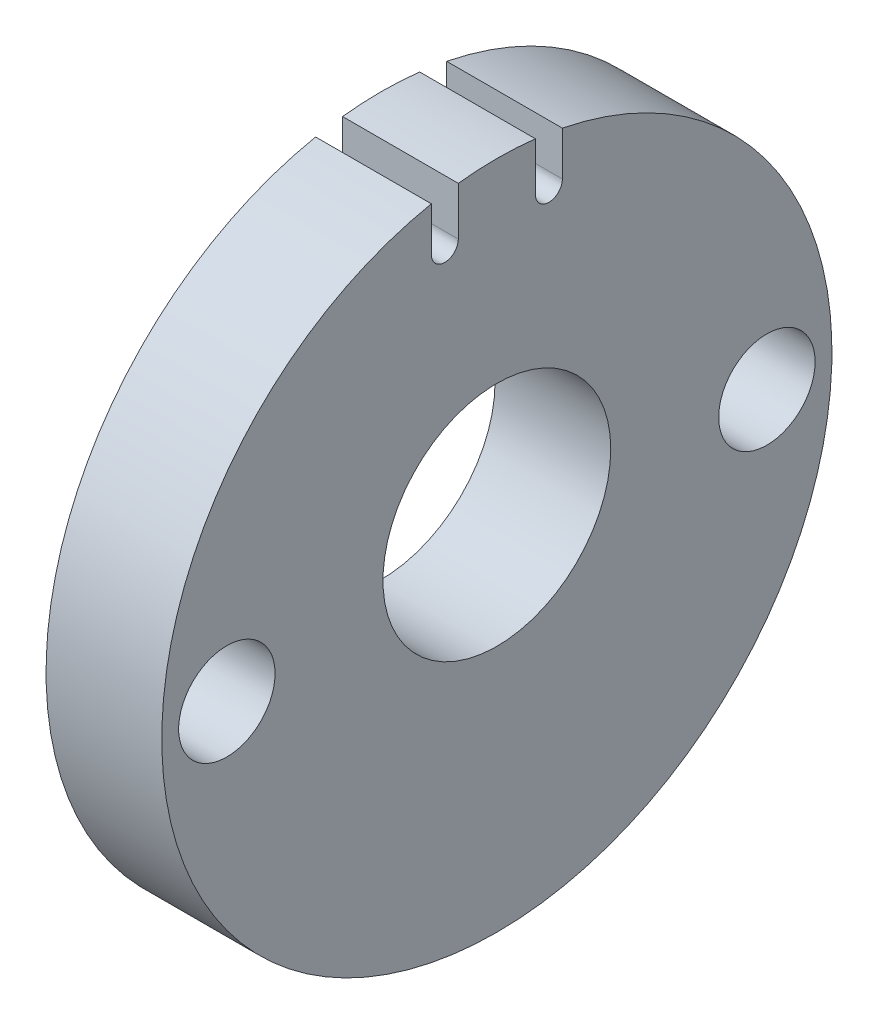
ISO-10303-21;
HEADER;
FILE_DESCRIPTION(('STEP AP214'),'2;1');
FILE_NAME('part.step','',(''),(''),'','','');
FILE_SCHEMA(('AUTOMOTIVE_DESIGN { 1 0 10303 214 1 1 1 1 }'));
ENDSEC;
DATA;
#1=APPLICATION_CONTEXT('core data for automotive mechanical design processes');
#2=APPLICATION_PROTOCOL_DEFINITION('international standard','automotive_design',2000,#1);
#3=PRODUCT_CONTEXT('',#1,'mechanical');
#4=PRODUCT('Part','Part','',(#3));
#5=PRODUCT_RELATED_PRODUCT_CATEGORY('part','',(#4));
#6=PRODUCT_DEFINITION_FORMATION('','',#4);
#7=PRODUCT_DEFINITION_CONTEXT('part definition',#1,'design');
#8=PRODUCT_DEFINITION('design','',#6,#7);
#9=PRODUCT_DEFINITION_SHAPE('','',#8);
#10=(LENGTH_UNIT() NAMED_UNIT(*) SI_UNIT(.MILLI.,.METRE.));
#11=(NAMED_UNIT(*) PLANE_ANGLE_UNIT() SI_UNIT($,.RADIAN.));
#12=(NAMED_UNIT(*) SI_UNIT($,.STERADIAN.) SOLID_ANGLE_UNIT());
#13=UNCERTAINTY_MEASURE_WITH_UNIT(LENGTH_MEASURE(1.E-05),#10,'distance_accuracy_value','');
#14=(GEOMETRIC_REPRESENTATION_CONTEXT(3) GLOBAL_UNCERTAINTY_ASSIGNED_CONTEXT((#13)) GLOBAL_UNIT_ASSIGNED_CONTEXT((#10,
#11,#12)) REPRESENTATION_CONTEXT('',''));
#15=CARTESIAN_POINT('',(0.,0.,0.));
#16=DIRECTION('',(0.,0.,1.));
#17=DIRECTION('',(1.,0.,0.));
#18=AXIS2_PLACEMENT_3D('',#15,#16,#17);
#19=CARTESIAN_POINT('',(6.,0.,-2.));
#20=DIRECTION('',(0.,0.,1.));
#21=DIRECTION('',(1.,0.,0.));
#22=AXIS2_PLACEMENT_3D('',#19,#20,#21);
#23=PLANE('',#22);
#24=DIRECTION('',(0.,1.,0.));
#25=VECTOR('',#24,1.);
#26=CARTESIAN_POINT('',(0.,0.,-2.));
#27=LINE('',#26,#25);
#28=CARTESIAN_POINT('',(0.,14.7552735572744,-2.));
#29=VERTEX_POINT('',#28);
#30=CARTESIAN_POINT('',(0.,17.2580988802359,-2.));
#31=VERTEX_POINT('',#30);
#32=EDGE_CURVE('E143',#29,#31,#27,.T.);
#33=ORIENTED_EDGE('',*,*,#32,.T.);
#34=DIRECTION('',(-1.,0.,0.));
#35=VECTOR('',#34,1.);
#36=CARTESIAN_POINT('',(6.,17.2580988802359,-2.));
#37=LINE('',#36,#35);
#38=CARTESIAN_POINT('',(6.,17.2580988802359,-2.));
#39=VERTEX_POINT('',#38);
#40=EDGE_CURVE('E11',#39,#31,#37,.T.);
#41=ORIENTED_EDGE('',*,*,#40,.F.);
#42=DIRECTION('',(0.,1.,0.));
#43=VECTOR('',#42,1.);
#44=CARTESIAN_POINT('',(6.,0.,-2.));
#45=LINE('',#44,#43);
#46=CARTESIAN_POINT('',(6.,14.7552735572744,-2.));
#47=VERTEX_POINT('',#46);
#48=EDGE_CURVE('E169',#47,#39,#45,.T.);
#49=ORIENTED_EDGE('',*,*,#48,.F.);
#50=DIRECTION('',(-1.,0.,0.));
#51=VECTOR('',#50,1.);
#52=CARTESIAN_POINT('',(6.,14.7552735572744,-2.));
#53=LINE('',#52,#51);
#54=EDGE_CURVE('E51',#47,#29,#53,.T.);
#55=ORIENTED_EDGE('',*,*,#54,.T.);
#56=EDGE_LOOP('',(#33,#41,#49,#55));
#57=FACE_BOUND('',#56,.T.);
#58=ADVANCED_FACE('F35',(#57),#23,.F.);
#59=CARTESIAN_POINT('',(6.,0.,0.));
#60=DIRECTION('',(-1.,0.,0.));
#61=DIRECTION('',(0.,0.,1.));
#62=AXIS2_PLACEMENT_3D('',#59,#60,#61);
#63=CYLINDRICAL_SURFACE('',#62,17.3736);
#64=CARTESIAN_POINT('',(0.,0.,0.));
#65=DIRECTION('',(1.,0.,0.));
#66=DIRECTION('',(0.,0.,-1.));
#67=AXIS2_PLACEMENT_3D('',#64,#65,#66);
#68=CIRCLE('',#67,17.3736);
#69=CARTESIAN_POINT('',(0.,17.2580988802359,2.));
#70=VERTEX_POINT('',#69);
#71=EDGE_CURVE('E145',#31,#70,#68,.T.);
#72=ORIENTED_EDGE('',*,*,#71,.T.);
#73=DIRECTION('',(-1.,0.,0.));
#74=VECTOR('',#73,1.);
#75=CARTESIAN_POINT('',(6.,17.2580988802359,2.));
#76=LINE('',#75,#74);
#77=CARTESIAN_POINT('',(6.,17.2580988802359,2.));
#78=VERTEX_POINT('',#77);
#79=EDGE_CURVE('E43',#78,#70,#76,.T.);
#80=ORIENTED_EDGE('',*,*,#79,.F.);
#81=CARTESIAN_POINT('',(6.,0.,0.));
#82=DIRECTION('',(1.,0.,0.));
#83=DIRECTION('',(0.,0.,-1.));
#84=AXIS2_PLACEMENT_3D('',#81,#82,#83);
#85=CIRCLE('',#84,17.3736);
#86=EDGE_CURVE('E89',#39,#78,#85,.T.);
#87=ORIENTED_EDGE('',*,*,#86,.F.);
#88=ORIENTED_EDGE('',*,*,#40,.T.);
#89=EDGE_LOOP('',(#72,#80,#87,#88));
#90=FACE_BOUND('',#89,.T.);
#91=ADVANCED_FACE('F183',(#90),#63,.T.);
#92=CARTESIAN_POINT('',(6.,0.,2.));
#93=DIRECTION('',(0.,0.,1.));
#94=DIRECTION('',(1.,0.,0.));
#95=AXIS2_PLACEMENT_3D('',#92,#93,#94);
#96=PLANE('',#95);
#97=DIRECTION('',(0.,1.,0.));
#98=VECTOR('',#97,1.);
#99=CARTESIAN_POINT('',(0.,0.,2.));
#100=LINE('',#99,#98);
#101=CARTESIAN_POINT('',(0.,14.7552735572744,2.));
#102=VERTEX_POINT('',#101);
#103=EDGE_CURVE('E148',#102,#70,#100,.T.);
#104=ORIENTED_EDGE('',*,*,#103,.F.);
#105=DIRECTION('',(-1.,0.,0.));
#106=VECTOR('',#105,1.);
#107=CARTESIAN_POINT('',(6.,14.7552735572744,2.));
#108=LINE('',#107,#106);
#109=CARTESIAN_POINT('',(6.,14.7552735572744,2.));
#110=VERTEX_POINT('',#109);
#111=EDGE_CURVE('E176',#110,#102,#108,.T.);
#112=ORIENTED_EDGE('',*,*,#111,.F.);
#113=DIRECTION('',(0.,1.,0.));
#114=VECTOR('',#113,1.);
#115=CARTESIAN_POINT('',(6.,0.,2.));
#116=LINE('',#115,#114);
#117=EDGE_CURVE('E182',#110,#78,#116,.T.);
#118=ORIENTED_EDGE('',*,*,#117,.T.);
#119=ORIENTED_EDGE('',*,*,#79,.T.);
#120=EDGE_LOOP('',(#104,#112,#118,#119));
#121=FACE_BOUND('',#120,.T.);
#122=ADVANCED_FACE('F180',(#121),#96,.T.);
#123=CARTESIAN_POINT('',(6.,14.7552735572744,2.6985));
#124=DIRECTION('',(-1.,0.,0.));
#125=DIRECTION('',(0.,0.,1.));
#126=AXIS2_PLACEMENT_3D('',#123,#124,#125);
#127=CYLINDRICAL_SURFACE('',#126,0.6985);
#128=CARTESIAN_POINT('',(0.,14.7552735572744,2.6985));
#129=DIRECTION('',(1.,0.,0.));
#130=DIRECTION('',(0.,0.,-1.));
#131=AXIS2_PLACEMENT_3D('',#128,#129,#130);
#132=CIRCLE('',#131,0.6985);
#133=CARTESIAN_POINT('',(0.,14.7552735572744,3.397));
#134=VERTEX_POINT('',#133);
#135=EDGE_CURVE('E151',#102,#134,#132,.F.);
#136=ORIENTED_EDGE('',*,*,#135,.T.);
#137=DIRECTION('',(-1.,0.,0.));
#138=VECTOR('',#137,1.);
#139=CARTESIAN_POINT('',(6.,14.7552735572744,3.397));
#140=LINE('',#139,#138);
#141=CARTESIAN_POINT('',(6.,14.7552735572744,3.397));
#142=VERTEX_POINT('',#141);
#143=EDGE_CURVE('E173',#142,#134,#140,.T.);
#144=ORIENTED_EDGE('',*,*,#143,.F.);
#145=CARTESIAN_POINT('',(6.,14.7552735572744,2.6985));
#146=DIRECTION('',(1.,0.,0.));
#147=DIRECTION('',(0.,0.,-1.));
#148=AXIS2_PLACEMENT_3D('',#145,#146,#147);
#149=CIRCLE('',#148,0.6985);
#150=EDGE_CURVE('E196',#110,#142,#149,.F.);
#151=ORIENTED_EDGE('',*,*,#150,.F.);
#152=ORIENTED_EDGE('',*,*,#111,.T.);
#153=EDGE_LOOP('',(#136,#144,#151,#152));
#154=FACE_BOUND('',#153,.T.);
#155=ADVANCED_FACE('F192',(#154),#127,.F.);
#156=CARTESIAN_POINT('',(6.,0.,3.397));
#157=DIRECTION('',(0.,0.,1.));
#158=DIRECTION('',(1.,0.,0.));
#159=AXIS2_PLACEMENT_3D('',#156,#157,#158);
#160=PLANE('',#159);
#161=DIRECTION('',(0.,1.,0.));
#162=VECTOR('',#161,1.);
#163=CARTESIAN_POINT('',(0.,0.,3.397));
#164=LINE('',#163,#162);
#165=CARTESIAN_POINT('',(0.,17.0382618820113,3.397));
#166=VERTEX_POINT('',#165);
#167=EDGE_CURVE('E153',#134,#166,#164,.T.);
#168=ORIENTED_EDGE('',*,*,#167,.T.);
#169=DIRECTION('',(-1.,0.,0.));
#170=VECTOR('',#169,1.);
#171=CARTESIAN_POINT('',(6.,17.0382618820113,3.397));
#172=LINE('',#171,#170);
#173=CARTESIAN_POINT('',(6.,17.0382618820113,3.397));
#174=VERTEX_POINT('',#173);
#175=EDGE_CURVE('E125',#174,#166,#172,.T.);
#176=ORIENTED_EDGE('',*,*,#175,.F.);
#177=DIRECTION('',(0.,1.,0.));
#178=VECTOR('',#177,1.);
#179=CARTESIAN_POINT('',(6.,0.,3.397));
#180=LINE('',#179,#178);
#181=EDGE_CURVE('E113',#142,#174,#180,.T.);
#182=ORIENTED_EDGE('',*,*,#181,.F.);
#183=ORIENTED_EDGE('',*,*,#143,.T.);
#184=EDGE_LOOP('',(#168,#176,#182,#183));
#185=FACE_BOUND('',#184,.T.);
#186=ADVANCED_FACE('F195',(#185),#160,.F.);
#187=CARTESIAN_POINT('',(0.,17.0382618820113,-3.397));
#188=VERTEX_POINT('',#187);
#189=EDGE_CURVE('E122',#166,#188,#68,.T.);
#190=ORIENTED_EDGE('',*,*,#189,.T.);
#191=DIRECTION('',(-1.,0.,0.));
#192=VECTOR('',#191,1.);
#193=CARTESIAN_POINT('',(6.,17.0382618820113,-3.397));
#194=LINE('',#193,#192);
#195=CARTESIAN_POINT('',(6.,17.0382618820113,-3.397));
#196=VERTEX_POINT('',#195);
#197=EDGE_CURVE('E119',#196,#188,#194,.T.);
#198=ORIENTED_EDGE('',*,*,#197,.F.);
#199=EDGE_CURVE('E105',#174,#196,#85,.T.);
#200=ORIENTED_EDGE('',*,*,#199,.F.);
#201=ORIENTED_EDGE('',*,*,#175,.T.);
#202=EDGE_LOOP('',(#190,#198,#200,#201));
#203=FACE_BOUND('',#202,.T.);
#204=ADVANCED_FACE('F120',(#203),#63,.T.);
#205=CARTESIAN_POINT('',(6.,0.,-3.397));
#206=DIRECTION('',(0.,0.,1.));
#207=DIRECTION('',(1.,0.,0.));
#208=AXIS2_PLACEMENT_3D('',#205,#206,#207);
#209=PLANE('',#208);
#210=DIRECTION('',(0.,1.,0.));
#211=VECTOR('',#210,1.);
#212=CARTESIAN_POINT('',(0.,0.,-3.397));
#213=LINE('',#212,#211);
#214=CARTESIAN_POINT('',(0.,14.7552735572744,-3.397));
#215=VERTEX_POINT('',#214);
#216=EDGE_CURVE('E155',#215,#188,#213,.T.);
#217=ORIENTED_EDGE('',*,*,#216,.F.);
#218=DIRECTION('',(-1.,0.,0.));
#219=VECTOR('',#218,1.);
#220=CARTESIAN_POINT('',(6.,14.7552735572744,-3.397));
#221=LINE('',#220,#219);
#222=CARTESIAN_POINT('',(6.,14.7552735572744,-3.397));
#223=VERTEX_POINT('',#222);
#224=EDGE_CURVE('E77',#223,#215,#221,.T.);
#225=ORIENTED_EDGE('',*,*,#224,.F.);
#226=DIRECTION('',(0.,1.,0.));
#227=VECTOR('',#226,1.);
#228=CARTESIAN_POINT('',(6.,0.,-3.397));
#229=LINE('',#228,#227);
#230=EDGE_CURVE('E111',#223,#196,#229,.T.);
#231=ORIENTED_EDGE('',*,*,#230,.T.);
#232=ORIENTED_EDGE('',*,*,#197,.T.);
#233=EDGE_LOOP('',(#217,#225,#231,#232));
#234=FACE_BOUND('',#233,.T.);
#235=ADVANCED_FACE('F127',(#234),#209,.T.);
#236=CARTESIAN_POINT('',(6.,0.,-14.));
#237=DIRECTION('',(-1.,0.,0.));
#238=DIRECTION('',(0.,0.,1.));
#239=AXIS2_PLACEMENT_3D('',#236,#237,#238);
#240=CYLINDRICAL_SURFACE('',#239,2.5);
#241=CARTESIAN_POINT('',(6.,0.,-14.));
#242=DIRECTION('',(1.,0.,0.));
#243=DIRECTION('',(0.,0.,-1.));
#244=AXIS2_PLACEMENT_3D('',#241,#242,#243);
#245=CIRCLE('',#244,2.5);
#246=CARTESIAN_POINT('',(6.,0.,-16.5));
#247=VERTEX_POINT('',#246);
#248=EDGE_CURVE('E137',#247,#247,#245,.T.);
#249=ORIENTED_EDGE('',*,*,#248,.T.);
#250=EDGE_LOOP('',(#249));
#251=FACE_BOUND('',#250,.T.);
#252=CARTESIAN_POINT('',(0.,0.,-14.));
#253=DIRECTION('',(1.,0.,0.));
#254=DIRECTION('',(0.,0.,-1.));
#255=AXIS2_PLACEMENT_3D('',#252,#253,#254);
#256=CIRCLE('',#255,2.5);
#257=CARTESIAN_POINT('',(0.,0.,-16.5));
#258=VERTEX_POINT('',#257);
#259=EDGE_CURVE('E163',#258,#258,#256,.T.);
#260=ORIENTED_EDGE('',*,*,#259,.F.);
#261=EDGE_LOOP('',(#260));
#262=FACE_BOUND('',#261,.T.);
#263=ADVANCED_FACE('F210',(#251,#262),#240,.F.);
#264=CARTESIAN_POINT('',(6.,0.,14.));
#265=DIRECTION('',(-1.,0.,0.));
#266=DIRECTION('',(0.,0.,1.));
#267=AXIS2_PLACEMENT_3D('',#264,#265,#266);
#268=CYLINDRICAL_SURFACE('',#267,2.5);
#269=CARTESIAN_POINT('',(6.,0.,14.));
#270=DIRECTION('',(1.,0.,0.));
#271=DIRECTION('',(0.,0.,-1.));
#272=AXIS2_PLACEMENT_3D('',#269,#270,#271);
#273=CIRCLE('',#272,2.5);
#274=CARTESIAN_POINT('',(6.,0.,11.5));
#275=VERTEX_POINT('',#274);
#276=EDGE_CURVE('E130',#275,#275,#273,.T.);
#277=ORIENTED_EDGE('',*,*,#276,.T.);
#278=EDGE_LOOP('',(#277));
#279=FACE_BOUND('',#278,.T.);
#280=CARTESIAN_POINT('',(0.,0.,14.));
#281=DIRECTION('',(1.,0.,0.));
#282=DIRECTION('',(0.,0.,-1.));
#283=AXIS2_PLACEMENT_3D('',#280,#281,#282);
#284=CIRCLE('',#283,2.5);
#285=CARTESIAN_POINT('',(0.,0.,11.5));
#286=VERTEX_POINT('',#285);
#287=EDGE_CURVE('E160',#286,#286,#284,.T.);
#288=ORIENTED_EDGE('',*,*,#287,.F.);
#289=EDGE_LOOP('',(#288));
#290=FACE_BOUND('',#289,.T.);
#291=ADVANCED_FACE('F202',(#279,#290),#268,.F.);
#292=CARTESIAN_POINT('',(6.,14.7552735572744,-2.6985));
#293=DIRECTION('',(-1.,0.,0.));
#294=DIRECTION('',(0.,0.,1.));
#295=AXIS2_PLACEMENT_3D('',#292,#293,#294);
#296=CYLINDRICAL_SURFACE('',#295,0.6985);
#297=CARTESIAN_POINT('',(0.,14.7552735572744,-2.6985));
#298=DIRECTION('',(1.,0.,0.));
#299=DIRECTION('',(0.,0.,-1.));
#300=AXIS2_PLACEMENT_3D('',#297,#298,#299);
#301=CIRCLE('',#300,0.6985);
#302=EDGE_CURVE('E157',#29,#215,#301,.T.);
#303=ORIENTED_EDGE('',*,*,#302,.F.);
#304=ORIENTED_EDGE('',*,*,#54,.F.);
#305=CARTESIAN_POINT('',(6.,14.7552735572744,-2.6985));
#306=DIRECTION('',(1.,0.,0.));
#307=DIRECTION('',(0.,0.,-1.));
#308=AXIS2_PLACEMENT_3D('',#305,#306,#307);
#309=CIRCLE('',#308,0.6985);
#310=EDGE_CURVE('E128',#47,#223,#309,.T.);
#311=ORIENTED_EDGE('',*,*,#310,.T.);
#312=ORIENTED_EDGE('',*,*,#224,.T.);
#313=EDGE_LOOP('',(#303,#304,#311,#312));
#314=FACE_BOUND('',#313,.T.);
#315=ADVANCED_FACE('F199',(#314),#296,.F.);
#316=CARTESIAN_POINT('',(6.,1.3715,0.));
#317=DIRECTION('',(-1.,0.,0.));
#318=DIRECTION('',(0.,0.,1.));
#319=AXIS2_PLACEMENT_3D('',#316,#317,#318);
#320=CYLINDRICAL_SURFACE('',#319,5.9055);
#321=CARTESIAN_POINT('',(6.,1.3715,0.));
#322=DIRECTION('',(1.,0.,0.));
#323=DIRECTION('',(0.,0.,-1.));
#324=AXIS2_PLACEMENT_3D('',#321,#322,#323);
#325=CIRCLE('',#324,5.9055);
#326=CARTESIAN_POINT('',(6.,1.3715,-5.9055));
#327=VERTEX_POINT('',#326);
#328=EDGE_CURVE('E140',#327,#327,#325,.T.);
#329=ORIENTED_EDGE('',*,*,#328,.T.);
#330=EDGE_LOOP('',(#329));
#331=FACE_BOUND('',#330,.T.);
#332=CARTESIAN_POINT('',(0.,1.3715,0.));
#333=DIRECTION('',(1.,0.,0.));
#334=DIRECTION('',(0.,0.,-1.));
#335=AXIS2_PLACEMENT_3D('',#332,#333,#334);
#336=CIRCLE('',#335,5.9055);
#337=CARTESIAN_POINT('',(0.,1.3715,-5.9055));
#338=VERTEX_POINT('',#337);
#339=EDGE_CURVE('E166',#338,#338,#336,.T.);
#340=ORIENTED_EDGE('',*,*,#339,.F.);
#341=EDGE_LOOP('',(#340));
#342=FACE_BOUND('',#341,.T.);
#343=ADVANCED_FACE('F201',(#331,#342),#320,.F.);
#344=CARTESIAN_POINT('',(6.,0.,0.));
#345=DIRECTION('',(1.,0.,0.));
#346=DIRECTION('',(0.,0.,-1.));
#347=AXIS2_PLACEMENT_3D('',#344,#345,#346);
#348=PLANE('',#347);
#349=ORIENTED_EDGE('',*,*,#48,.T.);
#350=ORIENTED_EDGE('',*,*,#86,.T.);
#351=ORIENTED_EDGE('',*,*,#117,.F.);
#352=ORIENTED_EDGE('',*,*,#150,.T.);
#353=ORIENTED_EDGE('',*,*,#181,.T.);
#354=ORIENTED_EDGE('',*,*,#199,.T.);
#355=ORIENTED_EDGE('',*,*,#230,.F.);
#356=ORIENTED_EDGE('',*,*,#310,.F.);
#357=EDGE_LOOP('',(#349,#350,#351,#352,#353,#354,#355,#356));
#358=FACE_BOUND('',#357,.T.);
#359=ORIENTED_EDGE('',*,*,#276,.F.);
#360=EDGE_LOOP('',(#359));
#361=FACE_BOUND('',#360,.T.);
#362=ORIENTED_EDGE('',*,*,#248,.F.);
#363=EDGE_LOOP('',(#362));
#364=FACE_BOUND('',#363,.T.);
#365=ORIENTED_EDGE('',*,*,#328,.F.);
#366=EDGE_LOOP('',(#365));
#367=FACE_BOUND('',#366,.T.);
#368=ADVANCED_FACE('F107',(#358,#361,#364,#367),#348,.T.);
#369=CARTESIAN_POINT('',(0.,0.,0.));
#370=DIRECTION('',(1.,0.,0.));
#371=DIRECTION('',(0.,0.,-1.));
#372=AXIS2_PLACEMENT_3D('',#369,#370,#371);
#373=PLANE('',#372);
#374=ORIENTED_EDGE('',*,*,#32,.F.);
#375=ORIENTED_EDGE('',*,*,#302,.T.);
#376=ORIENTED_EDGE('',*,*,#216,.T.);
#377=ORIENTED_EDGE('',*,*,#189,.F.);
#378=ORIENTED_EDGE('',*,*,#167,.F.);
#379=ORIENTED_EDGE('',*,*,#135,.F.);
#380=ORIENTED_EDGE('',*,*,#103,.T.);
#381=ORIENTED_EDGE('',*,*,#71,.F.);
#382=EDGE_LOOP('',(#374,#375,#376,#377,#378,#379,#380,#381));
#383=FACE_BOUND('',#382,.T.);
#384=ORIENTED_EDGE('',*,*,#287,.T.);
#385=EDGE_LOOP('',(#384));
#386=FACE_BOUND('',#385,.T.);
#387=ORIENTED_EDGE('',*,*,#259,.T.);
#388=EDGE_LOOP('',(#387));
#389=FACE_BOUND('',#388,.T.);
#390=ORIENTED_EDGE('',*,*,#339,.T.);
#391=EDGE_LOOP('',(#390));
#392=FACE_BOUND('',#391,.T.);
#393=ADVANCED_FACE('F187',(#383,#386,#389,#392),#373,.F.);
#394=CLOSED_SHELL('',(#58,#91,#122,#155,#186,#204,#235,#263,#291,#315,#343,#368,#393));
#395=MANIFOLD_SOLID_BREP('B2',#394);
#396=ADVANCED_BREP_SHAPE_REPRESENTATION('',(#18,#395),#14);
#397=SHAPE_DEFINITION_REPRESENTATION(#9,#396);
ENDSEC;
END-ISO-10303-21;
